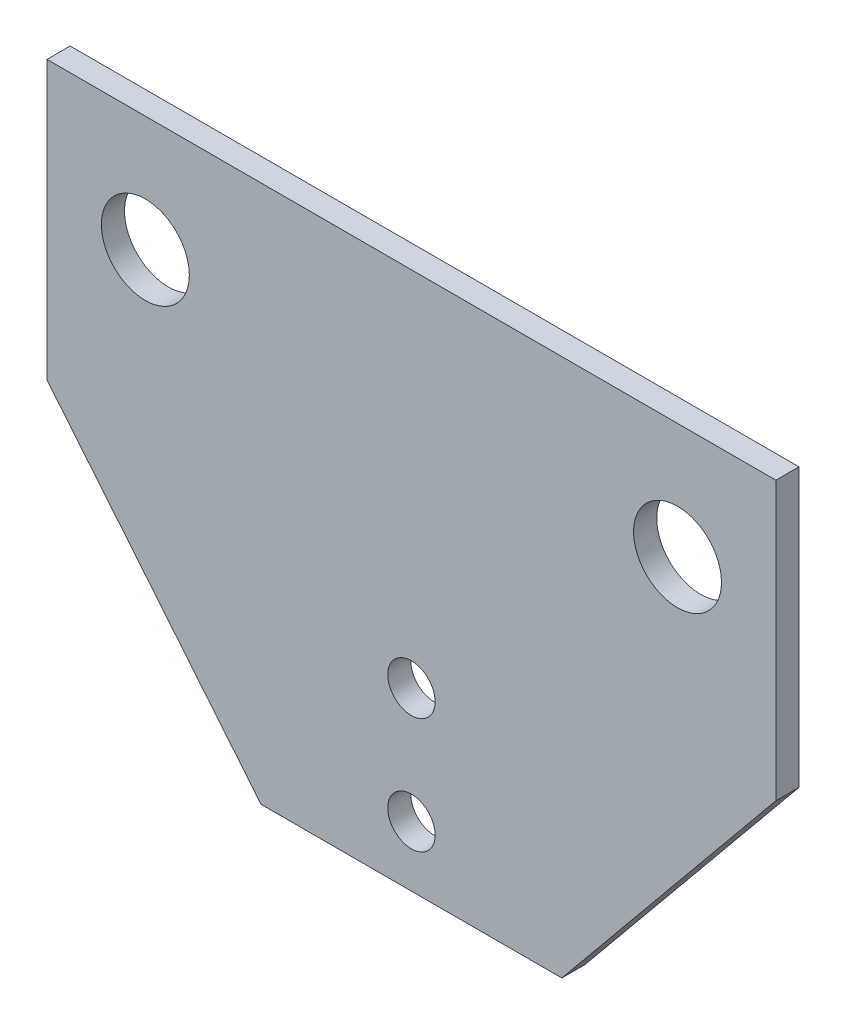
ISO-10303-21;
HEADER;
FILE_DESCRIPTION(('STEP AP214'),'2;1');
FILE_NAME('part.step','',(''),(''),'','','');
FILE_SCHEMA(('AUTOMOTIVE_DESIGN { 1 0 10303 214 1 1 1 1 }'));
ENDSEC;
DATA;
#1=APPLICATION_CONTEXT('core data for automotive mechanical design processes');
#2=APPLICATION_PROTOCOL_DEFINITION('international standard','automotive_design',2000,#1);
#3=PRODUCT_CONTEXT('',#1,'mechanical');
#4=PRODUCT('Part','Part','',(#3));
#5=PRODUCT_RELATED_PRODUCT_CATEGORY('part','',(#4));
#6=PRODUCT_DEFINITION_FORMATION('','',#4);
#7=PRODUCT_DEFINITION_CONTEXT('part definition',#1,'design');
#8=PRODUCT_DEFINITION('design','',#6,#7);
#9=PRODUCT_DEFINITION_SHAPE('','',#8);
#10=(LENGTH_UNIT() NAMED_UNIT(*) SI_UNIT(.MILLI.,.METRE.));
#11=(NAMED_UNIT(*) PLANE_ANGLE_UNIT() SI_UNIT($,.RADIAN.));
#12=(NAMED_UNIT(*) SI_UNIT($,.STERADIAN.) SOLID_ANGLE_UNIT());
#13=UNCERTAINTY_MEASURE_WITH_UNIT(LENGTH_MEASURE(1.E-05),#10,'distance_accuracy_value','');
#14=(GEOMETRIC_REPRESENTATION_CONTEXT(3) GLOBAL_UNCERTAINTY_ASSIGNED_CONTEXT((#13)) GLOBAL_UNIT_ASSIGNED_CONTEXT((#10,
#11,#12)) REPRESENTATION_CONTEXT('',''));
#15=CARTESIAN_POINT('',(0.,0.,0.));
#16=DIRECTION('',(0.,0.,1.));
#17=DIRECTION('',(1.,0.,0.));
#18=AXIS2_PLACEMENT_3D('',#15,#16,#17);
#19=CARTESIAN_POINT('',(0.,9.99999999999999,2.));
#20=DIRECTION('',(0.,-1.,0.));
#21=DIRECTION('',(1.,0.,0.));
#22=AXIS2_PLACEMENT_3D('',#19,#20,#21);
#23=PLANE('',#22);
#24=DIRECTION('',(-1.,0.,0.));
#25=VECTOR('',#24,1.);
#26=CARTESIAN_POINT('',(0.,9.99999999999999,0.));
#27=LINE('',#26,#25);
#28=CARTESIAN_POINT('',(31.5,9.99999999999999,0.));
#29=VERTEX_POINT('',#28);
#30=CARTESIAN_POINT('',(-31.5,10.,0.));
#31=VERTEX_POINT('',#30);
#32=EDGE_CURVE('E129',#29,#31,#27,.T.);
#33=ORIENTED_EDGE('',*,*,#32,.T.);
#34=DIRECTION('',(0.,0.,-1.));
#35=VECTOR('',#34,1.);
#36=CARTESIAN_POINT('',(-31.5,10.,2.));
#37=LINE('',#36,#35);
#38=CARTESIAN_POINT('',(-31.5,10.,2.));
#39=VERTEX_POINT('',#38);
#40=EDGE_CURVE('E11',#39,#31,#37,.T.);
#41=ORIENTED_EDGE('',*,*,#40,.F.);
#42=DIRECTION('',(-1.,0.,0.));
#43=VECTOR('',#42,1.);
#44=CARTESIAN_POINT('',(0.,9.99999999999999,2.));
#45=LINE('',#44,#43);
#46=CARTESIAN_POINT('',(31.5,9.99999999999999,2.));
#47=VERTEX_POINT('',#46);
#48=EDGE_CURVE('E139',#47,#39,#45,.T.);
#49=ORIENTED_EDGE('',*,*,#48,.F.);
#50=DIRECTION('',(0.,0.,-1.));
#51=VECTOR('',#50,1.);
#52=CARTESIAN_POINT('',(31.5,9.99999999999999,2.));
#53=LINE('',#52,#51);
#54=EDGE_CURVE('E61',#47,#29,#53,.T.);
#55=ORIENTED_EDGE('',*,*,#54,.T.);
#56=EDGE_LOOP('',(#33,#41,#49,#55));
#57=FACE_BOUND('',#56,.T.);
#58=ADVANCED_FACE('F44',(#57),#23,.F.);
#59=CARTESIAN_POINT('',(-31.5,0.,2.));
#60=DIRECTION('',(1.,0.,0.));
#61=DIRECTION('',(0.,0.,-1.));
#62=AXIS2_PLACEMENT_3D('',#59,#60,#61);
#63=PLANE('',#62);
#64=DIRECTION('',(0.,-1.,0.));
#65=VECTOR('',#64,1.);
#66=CARTESIAN_POINT('',(-31.5,0.,0.));
#67=LINE('',#66,#65);
#68=CARTESIAN_POINT('',(-31.5,-14.,0.));
#69=VERTEX_POINT('',#68);
#70=EDGE_CURVE('E134',#31,#69,#67,.T.);
#71=ORIENTED_EDGE('',*,*,#70,.T.);
#72=DIRECTION('',(0.,0.,-1.));
#73=VECTOR('',#72,1.);
#74=CARTESIAN_POINT('',(-31.5,-14.,2.));
#75=LINE('',#74,#73);
#76=CARTESIAN_POINT('',(-31.5,-14.,2.));
#77=VERTEX_POINT('',#76);
#78=EDGE_CURVE('E53',#77,#69,#75,.T.);
#79=ORIENTED_EDGE('',*,*,#78,.F.);
#80=DIRECTION('',(0.,-1.,0.));
#81=VECTOR('',#80,1.);
#82=CARTESIAN_POINT('',(-31.5,0.,2.));
#83=LINE('',#82,#81);
#84=EDGE_CURVE('E84',#39,#77,#83,.T.);
#85=ORIENTED_EDGE('',*,*,#84,.F.);
#86=ORIENTED_EDGE('',*,*,#40,.T.);
#87=EDGE_LOOP('',(#71,#79,#85,#86));
#88=FACE_BOUND('',#87,.T.);
#89=ADVANCED_FACE('F222',(#88),#63,.F.);
#90=CARTESIAN_POINT('',(-23.,0.,2.));
#91=DIRECTION('',(0.,0.,-1.));
#92=DIRECTION('',(-1.,0.,0.));
#93=AXIS2_PLACEMENT_3D('',#90,#91,#92);
#94=CYLINDRICAL_SURFACE('',#93,3.8);
#95=CARTESIAN_POINT('',(-23.,0.,2.));
#96=DIRECTION('',(0.,0.,1.));
#97=DIRECTION('',(1.,0.,0.));
#98=AXIS2_PLACEMENT_3D('',#95,#96,#97);
#99=CIRCLE('',#98,3.8);
#100=CARTESIAN_POINT('',(-19.2,0.,2.));
#101=VERTEX_POINT('',#100);
#102=EDGE_CURVE('E148',#101,#101,#99,.T.);
#103=ORIENTED_EDGE('',*,*,#102,.T.);
#104=EDGE_LOOP('',(#103));
#105=FACE_BOUND('',#104,.T.);
#106=CARTESIAN_POINT('',(-23.,0.,0.));
#107=DIRECTION('',(0.,0.,1.));
#108=DIRECTION('',(1.,0.,0.));
#109=AXIS2_PLACEMENT_3D('',#106,#107,#108);
#110=CIRCLE('',#109,3.8);
#111=CARTESIAN_POINT('',(-19.2,0.,0.));
#112=VERTEX_POINT('',#111);
#113=EDGE_CURVE('E161',#112,#112,#110,.T.);
#114=ORIENTED_EDGE('',*,*,#113,.F.);
#115=EDGE_LOOP('',(#114));
#116=FACE_BOUND('',#115,.T.);
#117=ADVANCED_FACE('F226',(#105,#116),#94,.F.);
#118=CARTESIAN_POINT('',(31.5,0.,2.));
#119=DIRECTION('',(1.,0.,0.));
#120=DIRECTION('',(0.,0.,-1.));
#121=AXIS2_PLACEMENT_3D('',#118,#119,#120);
#122=PLANE('',#121);
#123=DIRECTION('',(0.,-1.,0.));
#124=VECTOR('',#123,1.);
#125=CARTESIAN_POINT('',(31.5,0.,0.));
#126=LINE('',#125,#124);
#127=CARTESIAN_POINT('',(31.5,-14.,0.));
#128=VERTEX_POINT('',#127);
#129=EDGE_CURVE('E158',#29,#128,#126,.T.);
#130=ORIENTED_EDGE('',*,*,#129,.F.);
#131=ORIENTED_EDGE('',*,*,#54,.F.);
#132=DIRECTION('',(0.,-1.,0.));
#133=VECTOR('',#132,1.);
#134=CARTESIAN_POINT('',(31.5,0.,2.));
#135=LINE('',#134,#133);
#136=CARTESIAN_POINT('',(31.5,-14.,2.));
#137=VERTEX_POINT('',#136);
#138=EDGE_CURVE('E145',#47,#137,#135,.T.);
#139=ORIENTED_EDGE('',*,*,#138,.T.);
#140=DIRECTION('',(0.,0.,-1.));
#141=VECTOR('',#140,1.);
#142=CARTESIAN_POINT('',(31.5,-14.,2.));
#143=LINE('',#142,#141);
#144=EDGE_CURVE('E73',#137,#128,#143,.T.);
#145=ORIENTED_EDGE('',*,*,#144,.T.);
#146=EDGE_LOOP('',(#130,#131,#139,#145));
#147=FACE_BOUND('',#146,.T.);
#148=ADVANCED_FACE('F217',(#147),#122,.T.);
#149=CARTESIAN_POINT('',(23.,0.,2.));
#150=DIRECTION('',(0.,0.,-1.));
#151=DIRECTION('',(-1.,0.,0.));
#152=AXIS2_PLACEMENT_3D('',#149,#150,#151);
#153=CYLINDRICAL_SURFACE('',#152,3.8);
#154=CARTESIAN_POINT('',(23.,0.,2.));
#155=DIRECTION('',(0.,0.,1.));
#156=DIRECTION('',(1.,0.,0.));
#157=AXIS2_PLACEMENT_3D('',#154,#155,#156);
#158=CIRCLE('',#157,3.8);
#159=CARTESIAN_POINT('',(26.8,0.,2.));
#160=VERTEX_POINT('',#159);
#161=EDGE_CURVE('E152',#160,#160,#158,.F.);
#162=ORIENTED_EDGE('',*,*,#161,.F.);
#163=EDGE_LOOP('',(#162));
#164=FACE_BOUND('',#163,.T.);
#165=CARTESIAN_POINT('',(23.,0.,0.));
#166=DIRECTION('',(0.,0.,1.));
#167=DIRECTION('',(1.,0.,0.));
#168=AXIS2_PLACEMENT_3D('',#165,#166,#167);
#169=CIRCLE('',#168,3.8);
#170=CARTESIAN_POINT('',(26.8,0.,0.));
#171=VERTEX_POINT('',#170);
#172=EDGE_CURVE('E142',#171,#171,#169,.F.);
#173=ORIENTED_EDGE('',*,*,#172,.T.);
#174=EDGE_LOOP('',(#173));
#175=FACE_BOUND('',#174,.T.);
#176=ADVANCED_FACE('F210',(#164,#175),#153,.F.);
#177=CARTESIAN_POINT('',(0.,0.,2.));
#178=DIRECTION('',(0.,0.,1.));
#179=DIRECTION('',(1.,0.,0.));
#180=AXIS2_PLACEMENT_3D('',#177,#178,#179);
#181=PLANE('',#180);
#182=ORIENTED_EDGE('',*,*,#48,.T.);
#183=ORIENTED_EDGE('',*,*,#84,.T.);
#184=DIRECTION('',(-0.63484159071382,0.772642320029098,0.));
#185=VECTOR('',#184,1.);
#186=CARTESIAN_POINT('',(-25.6718255860496,-21.0932564384535,2.));
#187=LINE('',#186,#185);
#188=CARTESIAN_POINT('',(-13.,-36.5156686795933,2.));
#189=VERTEX_POINT('',#188);
#190=EDGE_CURVE('E113',#189,#77,#187,.T.);
#191=ORIENTED_EDGE('',*,*,#190,.F.);
#192=DIRECTION('',(1.,0.,0.));
#193=VECTOR('',#192,1.);
#194=CARTESIAN_POINT('',(0.,-36.5156686795933,2.));
#195=LINE('',#194,#193);
#196=CARTESIAN_POINT('',(13.,-36.5156686795933,2.));
#197=VERTEX_POINT('',#196);
#198=EDGE_CURVE('E114',#189,#197,#195,.T.);
#199=ORIENTED_EDGE('',*,*,#198,.T.);
#200=DIRECTION('',(0.63484159071382,0.772642320029098,0.));
#201=VECTOR('',#200,1.);
#202=CARTESIAN_POINT('',(25.6718255860496,-21.0932564384535,2.));
#203=LINE('',#202,#201);
#204=EDGE_CURVE('E103',#197,#137,#203,.T.);
#205=ORIENTED_EDGE('',*,*,#204,.T.);
#206=ORIENTED_EDGE('',*,*,#138,.F.);
#207=EDGE_LOOP('',(#182,#183,#191,#199,#205,#206));
#208=FACE_BOUND('',#207,.T.);
#209=ORIENTED_EDGE('',*,*,#102,.F.);
#210=EDGE_LOOP('',(#209));
#211=FACE_BOUND('',#210,.T.);
#212=ORIENTED_EDGE('',*,*,#161,.T.);
#213=EDGE_LOOP('',(#212));
#214=FACE_BOUND('',#213,.T.);
#215=CARTESIAN_POINT('',(0.,-31.2999555570793,2.));
#216=DIRECTION('',(0.,0.,1.));
#217=DIRECTION('',(1.,0.,0.));
#218=AXIS2_PLACEMENT_3D('',#215,#216,#217);
#219=CIRCLE('',#218,2.05);
#220=CARTESIAN_POINT('',(2.05,-31.2999555570793,2.));
#221=VERTEX_POINT('',#220);
#222=EDGE_CURVE('E182',#221,#221,#219,.T.);
#223=ORIENTED_EDGE('',*,*,#222,.F.);
#224=EDGE_LOOP('',(#223));
#225=FACE_BOUND('',#224,.T.);
#226=CARTESIAN_POINT('',(0.,-21.3220695835742,2.));
#227=DIRECTION('',(0.,0.,1.));
#228=DIRECTION('',(1.,0.,0.));
#229=AXIS2_PLACEMENT_3D('',#226,#227,#228);
#230=CIRCLE('',#229,2.05);
#231=CARTESIAN_POINT('',(2.05,-21.3220695835742,2.));
#232=VERTEX_POINT('',#231);
#233=EDGE_CURVE('E123',#232,#232,#230,.T.);
#234=ORIENTED_EDGE('',*,*,#233,.F.);
#235=EDGE_LOOP('',(#234));
#236=FACE_BOUND('',#235,.T.);
#237=ADVANCED_FACE('F118',(#208,#211,#214,#225,#236),#181,.T.);
#238=CARTESIAN_POINT('',(0.,0.,0.));
#239=DIRECTION('',(0.,0.,1.));
#240=DIRECTION('',(1.,0.,0.));
#241=AXIS2_PLACEMENT_3D('',#238,#239,#240);
#242=PLANE('',#241);
#243=ORIENTED_EDGE('',*,*,#32,.F.);
#244=ORIENTED_EDGE('',*,*,#129,.T.);
#245=DIRECTION('',(0.63484159071382,0.772642320029098,0.));
#246=VECTOR('',#245,1.);
#247=CARTESIAN_POINT('',(25.6718255860496,-21.0932564384535,0.));
#248=LINE('',#247,#246);
#249=CARTESIAN_POINT('',(13.,-36.5156686795933,0.));
#250=VERTEX_POINT('',#249);
#251=EDGE_CURVE('E183',#250,#128,#248,.T.);
#252=ORIENTED_EDGE('',*,*,#251,.F.);
#253=DIRECTION('',(1.,0.,0.));
#254=VECTOR('',#253,1.);
#255=CARTESIAN_POINT('',(0.,-36.5156686795933,0.));
#256=LINE('',#255,#254);
#257=CARTESIAN_POINT('',(-13.,-36.5156686795933,0.));
#258=VERTEX_POINT('',#257);
#259=EDGE_CURVE('E127',#258,#250,#256,.T.);
#260=ORIENTED_EDGE('',*,*,#259,.F.);
#261=DIRECTION('',(-0.63484159071382,0.772642320029098,0.));
#262=VECTOR('',#261,1.);
#263=CARTESIAN_POINT('',(-25.6718255860496,-21.0932564384535,0.));
#264=LINE('',#263,#262);
#265=EDGE_CURVE('E177',#258,#69,#264,.T.);
#266=ORIENTED_EDGE('',*,*,#265,.T.);
#267=ORIENTED_EDGE('',*,*,#70,.F.);
#268=EDGE_LOOP('',(#243,#244,#252,#260,#266,#267));
#269=FACE_BOUND('',#268,.T.);
#270=ORIENTED_EDGE('',*,*,#113,.T.);
#271=EDGE_LOOP('',(#270));
#272=FACE_BOUND('',#271,.T.);
#273=ORIENTED_EDGE('',*,*,#172,.F.);
#274=EDGE_LOOP('',(#273));
#275=FACE_BOUND('',#274,.T.);
#276=CARTESIAN_POINT('',(0.,-31.2999555570793,0.));
#277=DIRECTION('',(0.,0.,1.));
#278=DIRECTION('',(1.,0.,0.));
#279=AXIS2_PLACEMENT_3D('',#276,#277,#278);
#280=CIRCLE('',#279,2.05);
#281=CARTESIAN_POINT('',(2.05,-31.2999555570793,0.));
#282=VERTEX_POINT('',#281);
#283=EDGE_CURVE('E196',#282,#282,#280,.T.);
#284=ORIENTED_EDGE('',*,*,#283,.T.);
#285=EDGE_LOOP('',(#284));
#286=FACE_BOUND('',#285,.T.);
#287=CARTESIAN_POINT('',(0.,-21.3220695835742,0.));
#288=DIRECTION('',(0.,0.,1.));
#289=DIRECTION('',(1.,0.,0.));
#290=AXIS2_PLACEMENT_3D('',#287,#288,#289);
#291=CIRCLE('',#290,2.05);
#292=CARTESIAN_POINT('',(2.05,-21.3220695835742,0.));
#293=VERTEX_POINT('',#292);
#294=EDGE_CURVE('E192',#293,#293,#291,.T.);
#295=ORIENTED_EDGE('',*,*,#294,.T.);
#296=EDGE_LOOP('',(#295));
#297=FACE_BOUND('',#296,.T.);
#298=ADVANCED_FACE('F179',(#269,#272,#275,#286,#297),#242,.F.);
#299=CARTESIAN_POINT('',(0.,-36.5156686795933,2.));
#300=DIRECTION('',(0.,1.,0.));
#301=DIRECTION('',(0.,0.,1.));
#302=AXIS2_PLACEMENT_3D('',#299,#300,#301);
#303=PLANE('',#302);
#304=ORIENTED_EDGE('',*,*,#259,.T.);
#305=DIRECTION('',(0.,0.,-1.));
#306=VECTOR('',#305,1.);
#307=CARTESIAN_POINT('',(13.,-36.5156686795933,2.));
#308=LINE('',#307,#306);
#309=EDGE_CURVE('E108',#197,#250,#308,.T.);
#310=ORIENTED_EDGE('',*,*,#309,.F.);
#311=ORIENTED_EDGE('',*,*,#198,.F.);
#312=DIRECTION('',(0.,0.,-1.));
#313=VECTOR('',#312,1.);
#314=CARTESIAN_POINT('',(-13.,-36.5156686795933,2.));
#315=LINE('',#314,#313);
#316=EDGE_CURVE('E130',#189,#258,#315,.T.);
#317=ORIENTED_EDGE('',*,*,#316,.T.);
#318=EDGE_LOOP('',(#304,#310,#311,#317));
#319=FACE_BOUND('',#318,.T.);
#320=ADVANCED_FACE('F125',(#319),#303,.F.);
#321=CARTESIAN_POINT('',(25.6718255860496,-21.0932564384535,2.));
#322=DIRECTION('',(-0.772642320029098,0.63484159071382,0.));
#323=DIRECTION('',(-0.63484159071382,-0.772642320029098,0.));
#324=AXIS2_PLACEMENT_3D('',#321,#322,#323);
#325=PLANE('',#324);
#326=ORIENTED_EDGE('',*,*,#251,.T.);
#327=ORIENTED_EDGE('',*,*,#144,.F.);
#328=ORIENTED_EDGE('',*,*,#204,.F.);
#329=ORIENTED_EDGE('',*,*,#309,.T.);
#330=EDGE_LOOP('',(#326,#327,#328,#329));
#331=FACE_BOUND('',#330,.T.);
#332=ADVANCED_FACE('F106',(#331),#325,.F.);
#333=CARTESIAN_POINT('',(0.,-21.3220695835742,2.));
#334=DIRECTION('',(0.,0.,-1.));
#335=DIRECTION('',(-1.,0.,0.));
#336=AXIS2_PLACEMENT_3D('',#333,#334,#335);
#337=CYLINDRICAL_SURFACE('',#336,2.05);
#338=ORIENTED_EDGE('',*,*,#233,.T.);
#339=EDGE_LOOP('',(#338));
#340=FACE_BOUND('',#339,.T.);
#341=ORIENTED_EDGE('',*,*,#294,.F.);
#342=EDGE_LOOP('',(#341));
#343=FACE_BOUND('',#342,.T.);
#344=ADVANCED_FACE('F206',(#340,#343),#337,.F.);
#345=CARTESIAN_POINT('',(0.,-31.2999555570793,2.));
#346=DIRECTION('',(0.,0.,-1.));
#347=DIRECTION('',(-1.,0.,0.));
#348=AXIS2_PLACEMENT_3D('',#345,#346,#347);
#349=CYLINDRICAL_SURFACE('',#348,2.05);
#350=ORIENTED_EDGE('',*,*,#222,.T.);
#351=EDGE_LOOP('',(#350));
#352=FACE_BOUND('',#351,.T.);
#353=ORIENTED_EDGE('',*,*,#283,.F.);
#354=EDGE_LOOP('',(#353));
#355=FACE_BOUND('',#354,.T.);
#356=ADVANCED_FACE('F247',(#352,#355),#349,.F.);
#357=CARTESIAN_POINT('',(-25.6718255860496,-21.0932564384535,2.));
#358=DIRECTION('',(-0.772642320029098,-0.63484159071382,0.));
#359=DIRECTION('',(0.63484159071382,-0.772642320029098,0.));
#360=AXIS2_PLACEMENT_3D('',#357,#358,#359);
#361=PLANE('',#360);
#362=ORIENTED_EDGE('',*,*,#265,.F.);
#363=ORIENTED_EDGE('',*,*,#316,.F.);
#364=ORIENTED_EDGE('',*,*,#190,.T.);
#365=ORIENTED_EDGE('',*,*,#78,.T.);
#366=EDGE_LOOP('',(#362,#363,#364,#365));
#367=FACE_BOUND('',#366,.T.);
#368=ADVANCED_FACE('F176',(#367),#361,.T.);
#369=CLOSED_SHELL('',(#58,#89,#117,#148,#176,#237,#298,#320,#332,#344,#356,#368));
#370=MANIFOLD_SOLID_BREP('B2',#369);
#371=ADVANCED_BREP_SHAPE_REPRESENTATION('',(#18,#370),#14);
#372=SHAPE_DEFINITION_REPRESENTATION(#9,#371);
ENDSEC;
END-ISO-10303-21;
